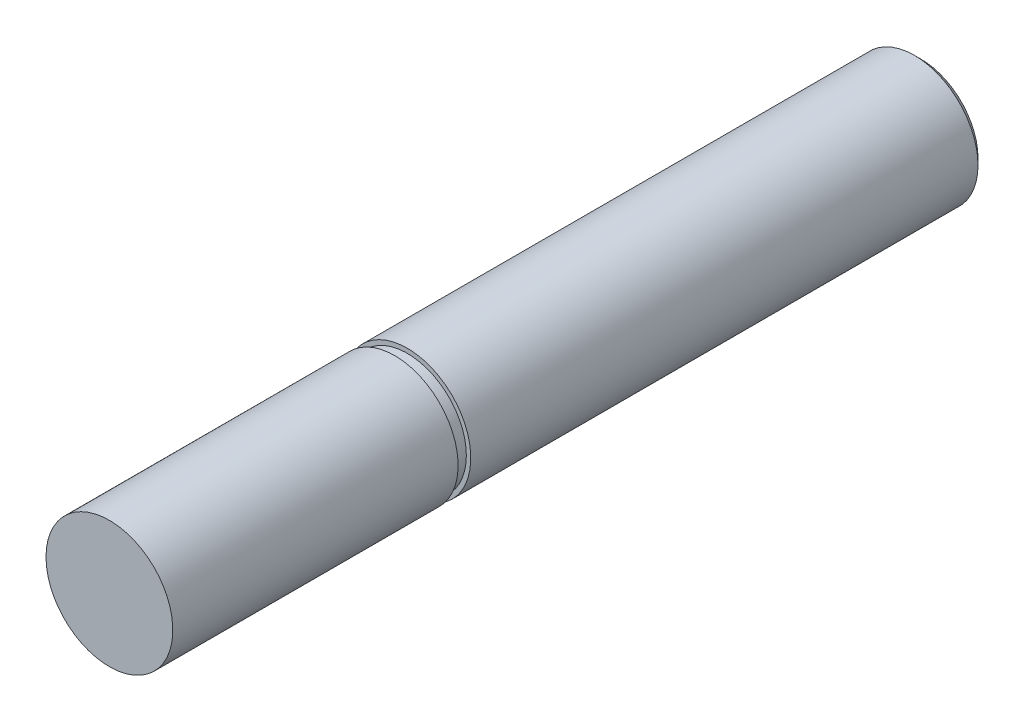
ISO-10303-21;
HEADER;
FILE_DESCRIPTION(('STEP AP214'),'2;1');
FILE_NAME('part.step','',(''),(''),'','','');
FILE_SCHEMA(('AUTOMOTIVE_DESIGN { 1 0 10303 214 1 1 1 1 }'));
ENDSEC;
DATA;
#1=APPLICATION_CONTEXT('core data for automotive mechanical design processes');
#2=APPLICATION_PROTOCOL_DEFINITION('international standard','automotive_design',2000,#1);
#3=PRODUCT_CONTEXT('',#1,'mechanical');
#4=PRODUCT('Part','Part','',(#3));
#5=PRODUCT_RELATED_PRODUCT_CATEGORY('part','',(#4));
#6=PRODUCT_DEFINITION_FORMATION('','',#4);
#7=PRODUCT_DEFINITION_CONTEXT('part definition',#1,'design');
#8=PRODUCT_DEFINITION('design','',#6,#7);
#9=PRODUCT_DEFINITION_SHAPE('','',#8);
#10=(LENGTH_UNIT() NAMED_UNIT(*) SI_UNIT(.MILLI.,.METRE.));
#11=(NAMED_UNIT(*) PLANE_ANGLE_UNIT() SI_UNIT($,.RADIAN.));
#12=(NAMED_UNIT(*) SI_UNIT($,.STERADIAN.) SOLID_ANGLE_UNIT());
#13=UNCERTAINTY_MEASURE_WITH_UNIT(LENGTH_MEASURE(1.E-05),#10,'distance_accuracy_value','');
#14=(GEOMETRIC_REPRESENTATION_CONTEXT(3) GLOBAL_UNCERTAINTY_ASSIGNED_CONTEXT((#13)) GLOBAL_UNIT_ASSIGNED_CONTEXT((#10,
#11,#12)) REPRESENTATION_CONTEXT('',''));
#15=CARTESIAN_POINT('',(0.,0.,0.));
#16=DIRECTION('',(0.,0.,1.));
#17=DIRECTION('',(1.,0.,0.));
#18=AXIS2_PLACEMENT_3D('',#15,#16,#17);
#19=CARTESIAN_POINT('',(0.,0.,104.));
#20=DIRECTION('',(0.,0.,-1.));
#21=DIRECTION('',(-1.,0.,0.));
#22=AXIS2_PLACEMENT_3D('',#19,#20,#21);
#23=CYLINDRICAL_SURFACE('',#22,5.);
#24=CARTESIAN_POINT('',(0.,0.,0.50000000000007));
#25=DIRECTION('',(0.,0.,1.));
#26=DIRECTION('',(1.,0.,0.));
#27=AXIS2_PLACEMENT_3D('',#24,#25,#26);
#28=CIRCLE('',#27,5.);
#29=CARTESIAN_POINT('',(-5.,0.,0.500000000000056));
#30=VERTEX_POINT('',#29);
#31=EDGE_CURVE('E43',#30,#30,#28,.T.);
#32=CARTESIAN_POINT('',(0.,0.,40.5));
#33=DIRECTION('',(0.,0.,-1.));
#34=DIRECTION('',(-1.,0.,0.));
#35=AXIS2_PLACEMENT_3D('',#32,#33,#34);
#36=CIRCLE('',#35,5.);
#37=CARTESIAN_POINT('',(-5.,0.,40.5));
#38=VERTEX_POINT('',#37);
#39=EDGE_CURVE('E47',#38,#38,#36,.T.);
#40=CARTESIAN_POINT('',(-5.,0.,0.500000000000056));
#41=CARTESIAN_POINT('',(-5.,0.,0.916666666666723));
#42=CARTESIAN_POINT('',(-5.,0.,1.33333333333339));
#43=CARTESIAN_POINT('',(-5.,0.,2.16666666666672));
#44=CARTESIAN_POINT('',(-5.,0.,2.58333333333339));
#45=CARTESIAN_POINT('',(-5.,0.,3.41666666666672));
#46=CARTESIAN_POINT('',(-5.,0.,3.83333333333338));
#47=CARTESIAN_POINT('',(-5.,0.,4.66666666666671));
#48=CARTESIAN_POINT('',(-5.,0.,5.08333333333338));
#49=CARTESIAN_POINT('',(-5.,0.,5.91666666666671));
#50=CARTESIAN_POINT('',(-5.,0.,6.33333333333338));
#51=CARTESIAN_POINT('',(-5.,0.,7.16666666666671));
#52=CARTESIAN_POINT('',(-5.,0.,7.58333333333338));
#53=CARTESIAN_POINT('',(-5.,0.,8.41666666666672));
#54=CARTESIAN_POINT('',(-5.,0.,8.83333333333338));
#55=CARTESIAN_POINT('',(-5.,0.,9.66666666666671));
#56=CARTESIAN_POINT('',(-5.,0.,10.0833333333334));
#57=CARTESIAN_POINT('',(-5.,0.,10.9166666666667));
#58=CARTESIAN_POINT('',(-5.,0.,11.3333333333334));
#59=CARTESIAN_POINT('',(-5.,0.,12.1666666666667));
#60=CARTESIAN_POINT('',(-5.,0.,12.5833333333334));
#61=CARTESIAN_POINT('',(-5.,0.,13.4166666666667));
#62=CARTESIAN_POINT('',(-5.,0.,13.8333333333334));
#63=CARTESIAN_POINT('',(-5.,0.,14.6666666666667));
#64=CARTESIAN_POINT('',(-5.,0.,15.0833333333334));
#65=CARTESIAN_POINT('',(-5.,0.,15.9166666666667));
#66=CARTESIAN_POINT('',(-5.,0.,16.3333333333334));
#67=CARTESIAN_POINT('',(-5.,0.,17.1666666666667));
#68=CARTESIAN_POINT('',(-5.,0.,17.5833333333334));
#69=CARTESIAN_POINT('',(-5.,0.,18.4166666666667));
#70=CARTESIAN_POINT('',(-5.,0.,18.8333333333334));
#71=CARTESIAN_POINT('',(-5.,0.,19.6666666666667));
#72=CARTESIAN_POINT('',(-5.,0.,20.0833333333334));
#73=CARTESIAN_POINT('',(-5.,0.,20.9166666666667));
#74=CARTESIAN_POINT('',(-5.,0.,21.3333333333334));
#75=CARTESIAN_POINT('',(-5.,0.,22.1666666666667));
#76=CARTESIAN_POINT('',(-5.,0.,22.5833333333334));
#77=CARTESIAN_POINT('',(-5.,0.,23.4166666666667));
#78=CARTESIAN_POINT('',(-5.,0.,23.8333333333334));
#79=CARTESIAN_POINT('',(-5.,0.,24.6666666666667));
#80=CARTESIAN_POINT('',(-5.,0.,25.0833333333334));
#81=CARTESIAN_POINT('',(-5.,0.,25.9166666666667));
#82=CARTESIAN_POINT('',(-5.,0.,26.3333333333334));
#83=CARTESIAN_POINT('',(-5.,0.,27.1666666666667));
#84=CARTESIAN_POINT('',(-5.,0.,27.5833333333334));
#85=CARTESIAN_POINT('',(-5.,0.,28.4166666666667));
#86=CARTESIAN_POINT('',(-5.,0.,28.8333333333334));
#87=CARTESIAN_POINT('',(-5.,0.,29.6666666666667));
#88=CARTESIAN_POINT('',(-5.,0.,30.0833333333334));
#89=CARTESIAN_POINT('',(-5.,0.,30.9166666666667));
#90=CARTESIAN_POINT('',(-5.,0.,31.3333333333334));
#91=CARTESIAN_POINT('',(-5.,0.,32.1666666666667));
#92=CARTESIAN_POINT('',(-5.,0.,32.5833333333333));
#93=CARTESIAN_POINT('',(-5.,0.,33.4166666666667));
#94=CARTESIAN_POINT('',(-5.,0.,33.8333333333333));
#95=CARTESIAN_POINT('',(-5.,0.,34.6666666666667));
#96=CARTESIAN_POINT('',(-5.,0.,35.0833333333333));
#97=CARTESIAN_POINT('',(-5.,0.,35.9166666666667));
#98=CARTESIAN_POINT('',(-5.,0.,36.3333333333333));
#99=CARTESIAN_POINT('',(-5.,0.,37.1666666666667));
#100=CARTESIAN_POINT('',(-5.,0.,37.5833333333333));
#101=CARTESIAN_POINT('',(-5.,0.,38.4166666666667));
#102=CARTESIAN_POINT('',(-5.,0.,38.8333333333333));
#103=CARTESIAN_POINT('',(-5.,0.,39.6666666666667));
#104=CARTESIAN_POINT('',(-5.,0.,40.0833333333333));
#105=CARTESIAN_POINT('',(-5.,0.,40.5));
#106=B_SPLINE_CURVE_WITH_KNOTS('',3,(#40,#41,#42,#43,#44,#45,#46,#47,#48,#49,#50,#51,#52,#53,
#54,#55,#56,#57,#58,#59,#60,#61,#62,#63,#64,#65,#66,#67,#68,#69,#70,#71,#72,#73,#74,#75,#76,#77,
#78,#79,#80,#81,#82,#83,#84,#85,#86,#87,#88,#89,#90,#91,#92,#93,#94,#95,#96,#97,#98,#99,#100,
#101,#102,#103,#104,#105),.UNSPECIFIED.,.F.,.F.,(4,2,2,2,2,2,2,2,2,2,2,2,2,2,2,2,2,2,2,2,2,2,2,
2,2,2,2,2,2,2,2,2,4),(0.,1.25,2.5,3.74999999999999,4.99999999999999,6.24999999999999,
7.49999999999999,8.74999999999999,9.99999999999998,11.25,12.5,13.75,15.,16.25,17.5,18.75,20.,
21.25,22.5,23.75,25.,26.25,27.5,28.75,30.,31.25,32.5,33.75,35.,36.25,37.5,38.75,40.),.UNSPECIFIED.);
#107=EDGE_CURVE('BSEAM32',#30,#38,#106,.T.);
#108=ORIENTED_EDGE('',*,*,#31,.T.);
#109=ORIENTED_EDGE('',*,*,#39,.T.);
#110=ORIENTED_EDGE('',*,*,#107,.T.);
#111=ORIENTED_EDGE('',*,*,#107,.F.);
#112=EDGE_LOOP('',(#108,#110,#109,#111));
#113=FACE_BOUND('',#112,.T.);
#114=ADVANCED_FACE('F32',(#113),#23,.T.);
#115=CARTESIAN_POINT('',(0.,0.,0.));
#116=DIRECTION('',(0.,0.,1.));
#117=DIRECTION('',(1.,0.,0.));
#118=AXIS2_PLACEMENT_3D('',#115,#116,#117);
#119=PLANE('',#118);
#120=CARTESIAN_POINT('',(0.,0.,0.));
#121=DIRECTION('',(0.,0.,1.));
#122=DIRECTION('',(1.,0.,0.));
#123=AXIS2_PLACEMENT_3D('',#120,#121,#122);
#124=CIRCLE('',#123,4.49999999999995);
#125=CARTESIAN_POINT('',(4.49999999999995,0.,0.));
#126=VERTEX_POINT('',#125);
#127=EDGE_CURVE('E39',#126,#126,#124,.F.);
#128=ORIENTED_EDGE('',*,*,#127,.T.);
#129=EDGE_LOOP('',(#128));
#130=FACE_BOUND('',#129,.T.);
#131=ADVANCED_FACE('F75',(#130),#119,.F.);
#132=CARTESIAN_POINT('',(4.65,0.,40.5));
#133=DIRECTION('',(0.,0.,-1.));
#134=DIRECTION('',(-1.,0.,0.));
#135=AXIS2_PLACEMENT_3D('',#132,#133,#134);
#136=PLANE('',#135);
#137=CARTESIAN_POINT('',(0.,0.,40.5));
#138=DIRECTION('',(0.,0.,1.));
#139=DIRECTION('',(1.,0.,0.));
#140=AXIS2_PLACEMENT_3D('',#137,#138,#139);
#141=CIRCLE('',#140,4.65);
#142=CARTESIAN_POINT('',(4.65,0.,40.5));
#143=VERTEX_POINT('',#142);
#144=EDGE_CURVE('E55',#143,#143,#141,.T.);
#145=ORIENTED_EDGE('',*,*,#144,.F.);
#146=EDGE_LOOP('',(#145));
#147=FACE_BOUND('',#146,.T.);
#148=ORIENTED_EDGE('',*,*,#39,.F.);
#149=EDGE_LOOP('',(#148));
#150=FACE_BOUND('',#149,.T.);
#151=ADVANCED_FACE('F72',(#147,#150),#136,.F.);
#152=CARTESIAN_POINT('',(4.65,0.,41.5));
#153=DIRECTION('',(0.,0.,1.));
#154=DIRECTION('',(1.,0.,0.));
#155=AXIS2_PLACEMENT_3D('',#152,#153,#154);
#156=PLANE('',#155);
#157=CARTESIAN_POINT('',(0.,0.,41.5));
#158=DIRECTION('',(0.,0.,1.));
#159=DIRECTION('',(1.,0.,0.));
#160=AXIS2_PLACEMENT_3D('',#157,#158,#159);
#161=CIRCLE('',#160,4.65);
#162=CARTESIAN_POINT('',(4.65,0.,41.5));
#163=VERTEX_POINT('',#162);
#164=EDGE_CURVE('E58',#163,#163,#161,.T.);
#165=ORIENTED_EDGE('',*,*,#164,.T.);
#166=EDGE_LOOP('',(#165));
#167=FACE_BOUND('',#166,.T.);
#168=CARTESIAN_POINT('',(0.,0.,41.5));
#169=DIRECTION('',(0.,0.,1.));
#170=DIRECTION('',(1.,0.,0.));
#171=AXIS2_PLACEMENT_3D('',#168,#169,#170);
#172=CIRCLE('',#171,5.);
#173=CARTESIAN_POINT('',(-5.,0.,41.5));
#174=VERTEX_POINT('',#173);
#175=EDGE_CURVE('E52',#174,#174,#172,.T.);
#176=ORIENTED_EDGE('',*,*,#175,.F.);
#177=EDGE_LOOP('',(#176));
#178=FACE_BOUND('',#177,.T.);
#179=ADVANCED_FACE('F62',(#167,#178),#156,.F.);
#180=CARTESIAN_POINT('',(0.,0.,104.));
#181=DIRECTION('',(0.,0.,1.));
#182=DIRECTION('',(1.,0.,0.));
#183=AXIS2_PLACEMENT_3D('',#180,#181,#182);
#184=CYLINDRICAL_SURFACE('',#183,4.65);
#185=ORIENTED_EDGE('',*,*,#164,.F.);
#186=EDGE_LOOP('',(#185));
#187=FACE_BOUND('',#186,.T.);
#188=ORIENTED_EDGE('',*,*,#144,.T.);
#189=EDGE_LOOP('',(#188));
#190=FACE_BOUND('',#189,.T.);
#191=ADVANCED_FACE('F65',(#187,#190),#184,.T.);
#192=CARTESIAN_POINT('',(0.,0.,64.));
#193=DIRECTION('',(0.,0.,-1.));
#194=DIRECTION('',(-1.,0.,0.));
#195=AXIS2_PLACEMENT_3D('',#192,#193,#194);
#196=CIRCLE('',#195,5.);
#197=CARTESIAN_POINT('',(-5.,0.,64.));
#198=VERTEX_POINT('',#197);
#199=EDGE_CURVE('E10',#198,#198,#196,.T.);
#200=CARTESIAN_POINT('',(-5.,0.,64.));
#201=CARTESIAN_POINT('',(-5.,0.,63.765625));
#202=CARTESIAN_POINT('',(-5.,0.,63.53125));
#203=CARTESIAN_POINT('',(-5.,0.,63.0625));
#204=CARTESIAN_POINT('',(-5.,0.,62.828125));
#205=CARTESIAN_POINT('',(-5.,0.,62.359375));
#206=CARTESIAN_POINT('',(-5.,0.,62.125));
#207=CARTESIAN_POINT('',(-5.,0.,61.65625));
#208=CARTESIAN_POINT('',(-5.,0.,61.421875));
#209=CARTESIAN_POINT('',(-5.,0.,60.953125));
#210=CARTESIAN_POINT('',(-5.,0.,60.71875));
#211=CARTESIAN_POINT('',(-5.,0.,60.25));
#212=CARTESIAN_POINT('',(-5.,0.,60.015625));
#213=CARTESIAN_POINT('',(-5.,0.,59.546875));
#214=CARTESIAN_POINT('',(-5.,0.,59.3125));
#215=CARTESIAN_POINT('',(-5.,0.,58.84375));
#216=CARTESIAN_POINT('',(-5.,0.,58.609375));
#217=CARTESIAN_POINT('',(-5.,0.,58.140625));
#218=CARTESIAN_POINT('',(-5.,0.,57.90625));
#219=CARTESIAN_POINT('',(-5.,0.,57.4375));
#220=CARTESIAN_POINT('',(-5.,0.,57.203125));
#221=CARTESIAN_POINT('',(-5.,0.,56.734375));
#222=CARTESIAN_POINT('',(-5.,0.,56.5));
#223=CARTESIAN_POINT('',(-5.,0.,56.03125));
#224=CARTESIAN_POINT('',(-5.,0.,55.796875));
#225=CARTESIAN_POINT('',(-5.,0.,55.328125));
#226=CARTESIAN_POINT('',(-5.,0.,55.09375));
#227=CARTESIAN_POINT('',(-5.,0.,54.625));
#228=CARTESIAN_POINT('',(-5.,0.,54.390625));
#229=CARTESIAN_POINT('',(-5.,0.,53.921875));
#230=CARTESIAN_POINT('',(-5.,0.,53.6875));
#231=CARTESIAN_POINT('',(-5.,0.,53.21875));
#232=CARTESIAN_POINT('',(-5.,0.,52.984375));
#233=CARTESIAN_POINT('',(-5.,0.,52.515625));
#234=CARTESIAN_POINT('',(-5.,0.,52.28125));
#235=CARTESIAN_POINT('',(-5.,0.,51.8125));
#236=CARTESIAN_POINT('',(-5.,0.,51.578125));
#237=CARTESIAN_POINT('',(-5.,0.,51.109375));
#238=CARTESIAN_POINT('',(-5.,0.,50.875));
#239=CARTESIAN_POINT('',(-5.,0.,50.40625));
#240=CARTESIAN_POINT('',(-5.,0.,50.171875));
#241=CARTESIAN_POINT('',(-5.,0.,49.703125));
#242=CARTESIAN_POINT('',(-5.,0.,49.46875));
#243=CARTESIAN_POINT('',(-5.,0.,49.));
#244=CARTESIAN_POINT('',(-5.,0.,48.765625));
#245=CARTESIAN_POINT('',(-5.,0.,48.296875));
#246=CARTESIAN_POINT('',(-5.,0.,48.0625));
#247=CARTESIAN_POINT('',(-5.,0.,47.59375));
#248=CARTESIAN_POINT('',(-5.,0.,47.359375));
#249=CARTESIAN_POINT('',(-5.,0.,46.890625));
#250=CARTESIAN_POINT('',(-5.,0.,46.65625));
#251=CARTESIAN_POINT('',(-5.,0.,46.1875));
#252=CARTESIAN_POINT('',(-5.,0.,45.953125));
#253=CARTESIAN_POINT('',(-5.,0.,45.484375));
#254=CARTESIAN_POINT('',(-5.,0.,45.25));
#255=CARTESIAN_POINT('',(-5.,0.,44.78125));
#256=CARTESIAN_POINT('',(-5.,0.,44.546875));
#257=CARTESIAN_POINT('',(-5.,0.,44.078125));
#258=CARTESIAN_POINT('',(-5.,0.,43.84375));
#259=CARTESIAN_POINT('',(-5.,0.,43.375));
#260=CARTESIAN_POINT('',(-5.,0.,43.140625));
#261=CARTESIAN_POINT('',(-5.,0.,42.671875));
#262=CARTESIAN_POINT('',(-5.,0.,42.4375));
#263=CARTESIAN_POINT('',(-5.,0.,41.96875));
#264=CARTESIAN_POINT('',(-5.,0.,41.734375));
#265=CARTESIAN_POINT('',(-5.,0.,41.5));
#266=B_SPLINE_CURVE_WITH_KNOTS('',3,(#200,#201,#202,#203,#204,#205,#206,#207,#208,#209,#210,
#211,#212,#213,#214,#215,#216,#217,#218,#219,#220,#221,#222,#223,#224,#225,#226,#227,#228,#229,
#230,#231,#232,#233,#234,#235,#236,#237,#238,#239,#240,#241,#242,#243,#244,#245,#246,#247,#248,
#249,#250,#251,#252,#253,#254,#255,#256,#257,#258,#259,#260,#261,#262,#263,#264,#265),
.UNSPECIFIED.,.F.,.F.,(4,2,2,2,2,2,2,2,2,2,2,2,2,2,2,2,2,2,2,2,2,2,2,2,2,2,2,2,2,2,2,2,4),(0.,
0.703124999999999,1.40625,2.109375,2.8125,3.515625,4.21875,4.921875,5.625,6.328125,7.03125,
7.73437500000001,8.43750000000001,9.14062500000001,9.84375000000001,10.546875,11.25,11.953125,
12.65625,13.359375,14.0625,14.765625,15.46875,16.171875,16.875,17.578125,18.28125,18.984375,
19.6875,20.390625,21.09375,21.796875,22.5),.UNSPECIFIED.);
#267=EDGE_CURVE('BSEAM68',#198,#174,#266,.T.);
#268=ORIENTED_EDGE('',*,*,#199,.T.);
#269=ORIENTED_EDGE('',*,*,#175,.T.);
#270=ORIENTED_EDGE('',*,*,#267,.T.);
#271=ORIENTED_EDGE('',*,*,#267,.F.);
#272=EDGE_LOOP('',(#268,#270,#269,#271));
#273=FACE_BOUND('',#272,.T.);
#274=ADVANCED_FACE('F68',(#273),#23,.T.);
#275=CARTESIAN_POINT('',(0.,0.,0.50000000000007));
#276=DIRECTION('',(0.,0.,1.));
#277=DIRECTION('',(1.,0.,0.));
#278=AXIS2_PLACEMENT_3D('',#275,#276,#277);
#279=CONICAL_SURFACE('',#278,5.,0.785398163397431);
#280=ORIENTED_EDGE('',*,*,#127,.F.);
#281=EDGE_LOOP('',(#280));
#282=FACE_BOUND('',#281,.T.);
#283=ORIENTED_EDGE('',*,*,#31,.F.);
#284=EDGE_LOOP('',(#283));
#285=FACE_BOUND('',#284,.T.);
#286=ADVANCED_FACE('F34',(#282,#285),#279,.T.);
#287=CARTESIAN_POINT('',(-15.310766205492,-5.,64.));
#288=DIRECTION('',(0.,0.,-1.));
#289=DIRECTION('',(-1.,0.,0.));
#290=AXIS2_PLACEMENT_3D('',#287,#288,#289);
#291=PLANE('',#290);
#292=ORIENTED_EDGE('',*,*,#199,.F.);
#293=EDGE_LOOP('',(#292));
#294=FACE_BOUND('',#293,.T.);
#295=ADVANCED_FACE('F89',(#294),#291,.F.);
#296=CLOSED_SHELL('',(#114,#131,#151,#179,#191,#274,#286,#295));
#297=MANIFOLD_SOLID_BREP('B2',#296);
#298=ADVANCED_BREP_SHAPE_REPRESENTATION('',(#18,#297),#14);
#299=SHAPE_DEFINITION_REPRESENTATION(#9,#298);
ENDSEC;
END-ISO-10303-21;
